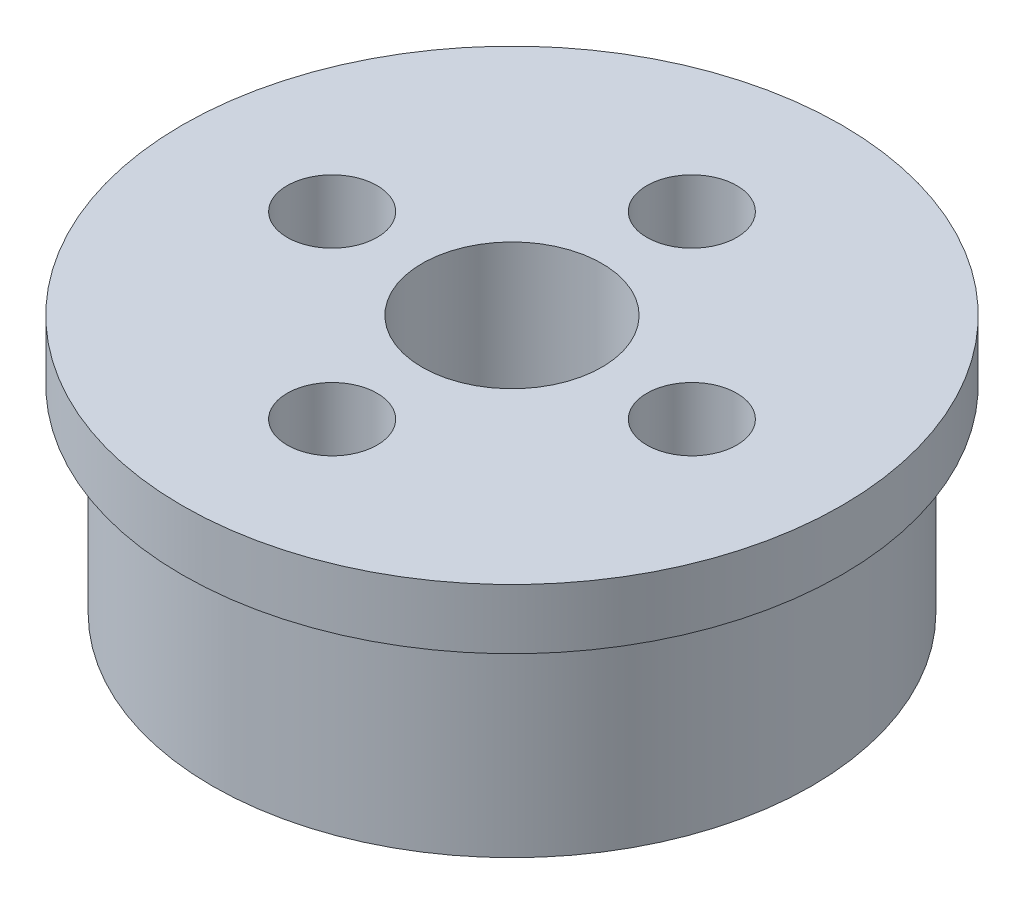
ISO-10303-21;
HEADER;
FILE_DESCRIPTION(('STEP AP214'),'2;1');
FILE_NAME('part.step','',(''),(''),'','','');
FILE_SCHEMA(('AUTOMOTIVE_DESIGN { 1 0 10303 214 1 1 1 1 }'));
ENDSEC;
DATA;
#1=APPLICATION_CONTEXT('core data for automotive mechanical design processes');
#2=APPLICATION_PROTOCOL_DEFINITION('international standard','automotive_design',2000,#1);
#3=PRODUCT_CONTEXT('',#1,'mechanical');
#4=PRODUCT('Part','Part','',(#3));
#5=PRODUCT_RELATED_PRODUCT_CATEGORY('part','',(#4));
#6=PRODUCT_DEFINITION_FORMATION('','',#4);
#7=PRODUCT_DEFINITION_CONTEXT('part definition',#1,'design');
#8=PRODUCT_DEFINITION('design','',#6,#7);
#9=PRODUCT_DEFINITION_SHAPE('','',#8);
#10=(LENGTH_UNIT() NAMED_UNIT(*) SI_UNIT(.MILLI.,.METRE.));
#11=(NAMED_UNIT(*) PLANE_ANGLE_UNIT() SI_UNIT($,.RADIAN.));
#12=(NAMED_UNIT(*) SI_UNIT($,.STERADIAN.) SOLID_ANGLE_UNIT());
#13=UNCERTAINTY_MEASURE_WITH_UNIT(LENGTH_MEASURE(1.E-05),#10,'distance_accuracy_value','');
#14=(GEOMETRIC_REPRESENTATION_CONTEXT(3) GLOBAL_UNCERTAINTY_ASSIGNED_CONTEXT((#13)) GLOBAL_UNIT_ASSIGNED_CONTEXT((#10,
#11,#12)) REPRESENTATION_CONTEXT('',''));
#15=CARTESIAN_POINT('',(0.,0.,0.));
#16=DIRECTION('',(0.,0.,1.));
#17=DIRECTION('',(1.,0.,0.));
#18=AXIS2_PLACEMENT_3D('',#15,#16,#17);
#19=CARTESIAN_POINT('',(0.,0.,0.));
#20=DIRECTION('',(0.,1.,0.));
#21=DIRECTION('',(0.,0.,1.));
#22=AXIS2_PLACEMENT_3D('',#19,#20,#21);
#23=PLANE('',#22);
#24=CARTESIAN_POINT('',(0.,0.,-6.));
#25=DIRECTION('',(0.,-1.,0.));
#26=DIRECTION('',(0.,0.,1.));
#27=AXIS2_PLACEMENT_3D('',#24,#25,#26);
#28=CIRCLE('',#27,1.5);
#29=CARTESIAN_POINT('',(0.,0.,-4.5));
#30=VERTEX_POINT('',#29);
#31=EDGE_CURVE('E66',#30,#30,#28,.T.);
#32=ORIENTED_EDGE('',*,*,#31,.F.);
#33=EDGE_LOOP('',(#32));
#34=FACE_BOUND('',#33,.T.);
#35=CARTESIAN_POINT('',(6.,0.,0.));
#36=DIRECTION('',(0.,-1.,0.));
#37=DIRECTION('',(-1.,0.,0.));
#38=AXIS2_PLACEMENT_3D('',#35,#36,#37);
#39=CIRCLE('',#38,1.5);
#40=CARTESIAN_POINT('',(4.5,0.,0.));
#41=VERTEX_POINT('',#40);
#42=EDGE_CURVE('E72',#41,#41,#39,.T.);
#43=ORIENTED_EDGE('',*,*,#42,.F.);
#44=EDGE_LOOP('',(#43));
#45=FACE_BOUND('',#44,.T.);
#46=CARTESIAN_POINT('',(-6.,0.,0.));
#47=DIRECTION('',(0.,-1.,0.));
#48=DIRECTION('',(1.,0.,0.));
#49=AXIS2_PLACEMENT_3D('',#46,#47,#48);
#50=CIRCLE('',#49,1.5);
#51=CARTESIAN_POINT('',(-4.5,0.,0.));
#52=VERTEX_POINT('',#51);
#53=EDGE_CURVE('E60',#52,#52,#50,.T.);
#54=ORIENTED_EDGE('',*,*,#53,.F.);
#55=EDGE_LOOP('',(#54));
#56=FACE_BOUND('',#55,.T.);
#57=CARTESIAN_POINT('',(0.,0.,6.));
#58=DIRECTION('',(0.,-1.,0.));
#59=DIRECTION('',(0.,0.,-1.));
#60=AXIS2_PLACEMENT_3D('',#57,#58,#59);
#61=CIRCLE('',#60,1.5);
#62=CARTESIAN_POINT('',(0.,0.,4.5));
#63=VERTEX_POINT('',#62);
#64=EDGE_CURVE('E56',#63,#63,#61,.T.);
#65=ORIENTED_EDGE('',*,*,#64,.F.);
#66=EDGE_LOOP('',(#65));
#67=FACE_BOUND('',#66,.T.);
#68=CARTESIAN_POINT('',(0.,0.,0.));
#69=DIRECTION('',(0.,1.,0.));
#70=DIRECTION('',(0.,0.,1.));
#71=AXIS2_PLACEMENT_3D('',#68,#69,#70);
#72=CIRCLE('',#71,10.);
#73=CARTESIAN_POINT('',(0.,0.,10.));
#74=VERTEX_POINT('',#73);
#75=EDGE_CURVE('E36',#74,#74,#72,.T.);
#76=ORIENTED_EDGE('',*,*,#75,.F.);
#77=EDGE_LOOP('',(#76));
#78=FACE_BOUND('',#77,.T.);
#79=CARTESIAN_POINT('',(0.,0.,0.));
#80=DIRECTION('',(0.,1.,0.));
#81=DIRECTION('',(0.,0.,1.));
#82=AXIS2_PLACEMENT_3D('',#79,#80,#81);
#83=CIRCLE('',#82,3.);
#84=CARTESIAN_POINT('',(0.,0.,3.));
#85=VERTEX_POINT('',#84);
#86=EDGE_CURVE('E43',#85,#85,#83,.T.);
#87=ORIENTED_EDGE('',*,*,#86,.T.);
#88=EDGE_LOOP('',(#87));
#89=FACE_BOUND('',#88,.T.);
#90=ADVANCED_FACE('F32',(#34,#45,#56,#67,#78,#89),#23,.F.);
#91=CARTESIAN_POINT('',(0.,6.6,0.));
#92=DIRECTION('',(0.,-1.,0.));
#93=DIRECTION('',(0.,0.,-1.));
#94=AXIS2_PLACEMENT_3D('',#91,#92,#93);
#95=CYLINDRICAL_SURFACE('',#94,10.);
#96=CARTESIAN_POINT('',(0.,6.6,0.));
#97=DIRECTION('',(0.,1.,0.));
#98=DIRECTION('',(0.,0.,1.));
#99=AXIS2_PLACEMENT_3D('',#96,#97,#98);
#100=CIRCLE('',#99,10.);
#101=CARTESIAN_POINT('',(0.,6.6,10.));
#102=VERTEX_POINT('',#101);
#103=EDGE_CURVE('E10',#102,#102,#100,.T.);
#104=ORIENTED_EDGE('',*,*,#103,.F.);
#105=EDGE_LOOP('',(#104));
#106=FACE_BOUND('',#105,.T.);
#107=ORIENTED_EDGE('',*,*,#75,.T.);
#108=EDGE_LOOP('',(#107));
#109=FACE_BOUND('',#108,.T.);
#110=ADVANCED_FACE('F34',(#106,#109),#95,.T.);
#111=CARTESIAN_POINT('',(0.,6.6,0.));
#112=DIRECTION('',(0.,-1.,0.));
#113=DIRECTION('',(0.,0.,-1.));
#114=AXIS2_PLACEMENT_3D('',#111,#112,#113);
#115=CYLINDRICAL_SURFACE('',#114,3.);
#116=ORIENTED_EDGE('',*,*,#86,.F.);
#117=EDGE_LOOP('',(#116));
#118=FACE_BOUND('',#117,.T.);
#119=CARTESIAN_POINT('',(0.,8.6,0.));
#120=DIRECTION('',(0.,1.,0.));
#121=DIRECTION('',(0.,0.,1.));
#122=AXIS2_PLACEMENT_3D('',#119,#120,#121);
#123=CIRCLE('',#122,3.);
#124=CARTESIAN_POINT('',(0.,8.6,3.));
#125=VERTEX_POINT('',#124);
#126=EDGE_CURVE('E51',#125,#125,#123,.T.);
#127=ORIENTED_EDGE('',*,*,#126,.T.);
#128=EDGE_LOOP('',(#127));
#129=FACE_BOUND('',#128,.T.);
#130=ADVANCED_FACE('F95',(#118,#129),#115,.F.);
#131=CARTESIAN_POINT('',(0.,6.6,0.));
#132=DIRECTION('',(0.,1.,0.));
#133=DIRECTION('',(0.,0.,1.));
#134=AXIS2_PLACEMENT_3D('',#131,#132,#133);
#135=PLANE('',#134);
#136=CARTESIAN_POINT('',(0.,6.6,0.));
#137=DIRECTION('',(0.,1.,0.));
#138=DIRECTION('',(0.,0.,1.));
#139=AXIS2_PLACEMENT_3D('',#136,#137,#138);
#140=CIRCLE('',#139,11.);
#141=CARTESIAN_POINT('',(0.,6.6,11.));
#142=VERTEX_POINT('',#141);
#143=EDGE_CURVE('E48',#142,#142,#140,.T.);
#144=ORIENTED_EDGE('',*,*,#143,.F.);
#145=EDGE_LOOP('',(#144));
#146=FACE_BOUND('',#145,.T.);
#147=ORIENTED_EDGE('',*,*,#103,.T.);
#148=EDGE_LOOP('',(#147));
#149=FACE_BOUND('',#148,.T.);
#150=ADVANCED_FACE('F98',(#146,#149),#135,.F.);
#151=CARTESIAN_POINT('',(0.,8.6,0.));
#152=DIRECTION('',(0.,1.,0.));
#153=DIRECTION('',(0.,0.,1.));
#154=AXIS2_PLACEMENT_3D('',#151,#152,#153);
#155=PLANE('',#154);
#156=CARTESIAN_POINT('',(0.,8.6,-6.));
#157=DIRECTION('',(0.,1.,0.));
#158=DIRECTION('',(0.,0.,1.));
#159=AXIS2_PLACEMENT_3D('',#156,#157,#158);
#160=CIRCLE('',#159,1.5);
#161=CARTESIAN_POINT('',(0.,8.6,-4.5));
#162=VERTEX_POINT('',#161);
#163=EDGE_CURVE('E75',#162,#162,#160,.F.);
#164=ORIENTED_EDGE('',*,*,#163,.T.);
#165=EDGE_LOOP('',(#164));
#166=FACE_BOUND('',#165,.T.);
#167=CARTESIAN_POINT('',(6.,8.6,0.));
#168=DIRECTION('',(0.,1.,0.));
#169=DIRECTION('',(0.,0.,1.));
#170=AXIS2_PLACEMENT_3D('',#167,#168,#169);
#171=CIRCLE('',#170,1.5);
#172=CARTESIAN_POINT('',(6.,8.6,1.50000000000006));
#173=VERTEX_POINT('',#172);
#174=EDGE_CURVE('E69',#173,#173,#171,.F.);
#175=ORIENTED_EDGE('',*,*,#174,.T.);
#176=EDGE_LOOP('',(#175));
#177=FACE_BOUND('',#176,.T.);
#178=CARTESIAN_POINT('',(-6.,8.6,0.));
#179=DIRECTION('',(0.,1.,0.));
#180=DIRECTION('',(0.,0.,1.));
#181=AXIS2_PLACEMENT_3D('',#178,#179,#180);
#182=CIRCLE('',#181,1.5);
#183=CARTESIAN_POINT('',(-6.,8.6,1.49999999999998));
#184=VERTEX_POINT('',#183);
#185=EDGE_CURVE('E63',#184,#184,#182,.F.);
#186=ORIENTED_EDGE('',*,*,#185,.T.);
#187=EDGE_LOOP('',(#186));
#188=FACE_BOUND('',#187,.T.);
#189=CARTESIAN_POINT('',(0.,8.6,6.));
#190=DIRECTION('',(0.,1.,0.));
#191=DIRECTION('',(0.,0.,1.));
#192=AXIS2_PLACEMENT_3D('',#189,#190,#191);
#193=CIRCLE('',#192,1.5);
#194=CARTESIAN_POINT('',(0.,8.6,7.5));
#195=VERTEX_POINT('',#194);
#196=EDGE_CURVE('E57',#195,#195,#193,.F.);
#197=ORIENTED_EDGE('',*,*,#196,.T.);
#198=EDGE_LOOP('',(#197));
#199=FACE_BOUND('',#198,.T.);
#200=CARTESIAN_POINT('',(0.,8.6,0.));
#201=DIRECTION('',(0.,1.,0.));
#202=DIRECTION('',(0.,0.,1.));
#203=AXIS2_PLACEMENT_3D('',#200,#201,#202);
#204=CIRCLE('',#203,11.);
#205=CARTESIAN_POINT('',(0.,8.6,11.));
#206=VERTEX_POINT('',#205);
#207=EDGE_CURVE('E47',#206,#206,#204,.T.);
#208=ORIENTED_EDGE('',*,*,#207,.T.);
#209=EDGE_LOOP('',(#208));
#210=FACE_BOUND('',#209,.T.);
#211=ORIENTED_EDGE('',*,*,#126,.F.);
#212=EDGE_LOOP('',(#211));
#213=FACE_BOUND('',#212,.T.);
#214=ADVANCED_FACE('F102',(#166,#177,#188,#199,#210,#213),#155,.T.);
#215=CARTESIAN_POINT('',(0.,8.6,0.));
#216=DIRECTION('',(0.,-1.,0.));
#217=DIRECTION('',(0.,0.,-1.));
#218=AXIS2_PLACEMENT_3D('',#215,#216,#217);
#219=CYLINDRICAL_SURFACE('',#218,11.);
#220=ORIENTED_EDGE('',*,*,#207,.F.);
#221=EDGE_LOOP('',(#220));
#222=FACE_BOUND('',#221,.T.);
#223=ORIENTED_EDGE('',*,*,#143,.T.);
#224=EDGE_LOOP('',(#223));
#225=FACE_BOUND('',#224,.T.);
#226=ADVANCED_FACE('F104',(#222,#225),#219,.T.);
#227=CARTESIAN_POINT('',(0.,8.601,6.));
#228=DIRECTION('',(0.,-1.,0.));
#229=DIRECTION('',(0.,0.,-1.));
#230=AXIS2_PLACEMENT_3D('',#227,#228,#229);
#231=CYLINDRICAL_SURFACE('',#230,1.5);
#232=ORIENTED_EDGE('',*,*,#196,.F.);
#233=EDGE_LOOP('',(#232));
#234=FACE_BOUND('',#233,.T.);
#235=ORIENTED_EDGE('',*,*,#64,.T.);
#236=EDGE_LOOP('',(#235));
#237=FACE_BOUND('',#236,.T.);
#238=ADVANCED_FACE('F111',(#234,#237),#231,.F.);
#239=CARTESIAN_POINT('',(-6.,8.601,0.));
#240=DIRECTION('',(0.,-1.,0.));
#241=DIRECTION('',(0.,0.,-1.));
#242=AXIS2_PLACEMENT_3D('',#239,#240,#241);
#243=CYLINDRICAL_SURFACE('',#242,1.5);
#244=ORIENTED_EDGE('',*,*,#185,.F.);
#245=EDGE_LOOP('',(#244));
#246=FACE_BOUND('',#245,.T.);
#247=ORIENTED_EDGE('',*,*,#53,.T.);
#248=EDGE_LOOP('',(#247));
#249=FACE_BOUND('',#248,.T.);
#250=ADVANCED_FACE('F120',(#246,#249),#243,.F.);
#251=CARTESIAN_POINT('',(6.,8.601,0.));
#252=DIRECTION('',(0.,-1.,0.));
#253=DIRECTION('',(0.,0.,-1.));
#254=AXIS2_PLACEMENT_3D('',#251,#252,#253);
#255=CYLINDRICAL_SURFACE('',#254,1.5);
#256=ORIENTED_EDGE('',*,*,#174,.F.);
#257=EDGE_LOOP('',(#256));
#258=FACE_BOUND('',#257,.T.);
#259=ORIENTED_EDGE('',*,*,#42,.T.);
#260=EDGE_LOOP('',(#259));
#261=FACE_BOUND('',#260,.T.);
#262=ADVANCED_FACE('F124',(#258,#261),#255,.F.);
#263=CARTESIAN_POINT('',(0.,8.601,-6.));
#264=DIRECTION('',(0.,-1.,0.));
#265=DIRECTION('',(0.,0.,-1.));
#266=AXIS2_PLACEMENT_3D('',#263,#264,#265);
#267=CYLINDRICAL_SURFACE('',#266,1.5);
#268=ORIENTED_EDGE('',*,*,#163,.F.);
#269=EDGE_LOOP('',(#268));
#270=FACE_BOUND('',#269,.T.);
#271=ORIENTED_EDGE('',*,*,#31,.T.);
#272=EDGE_LOOP('',(#271));
#273=FACE_BOUND('',#272,.T.);
#274=ADVANCED_FACE('F81',(#270,#273),#267,.F.);
#275=CLOSED_SHELL('',(#90,#110,#130,#150,#214,#226,#238,#250,#262,#274));
#276=MANIFOLD_SOLID_BREP('B2',#275);
#277=ADVANCED_BREP_SHAPE_REPRESENTATION('',(#18,#276),#14);
#278=SHAPE_DEFINITION_REPRESENTATION(#9,#277);
ENDSEC;
END-ISO-10303-21;
